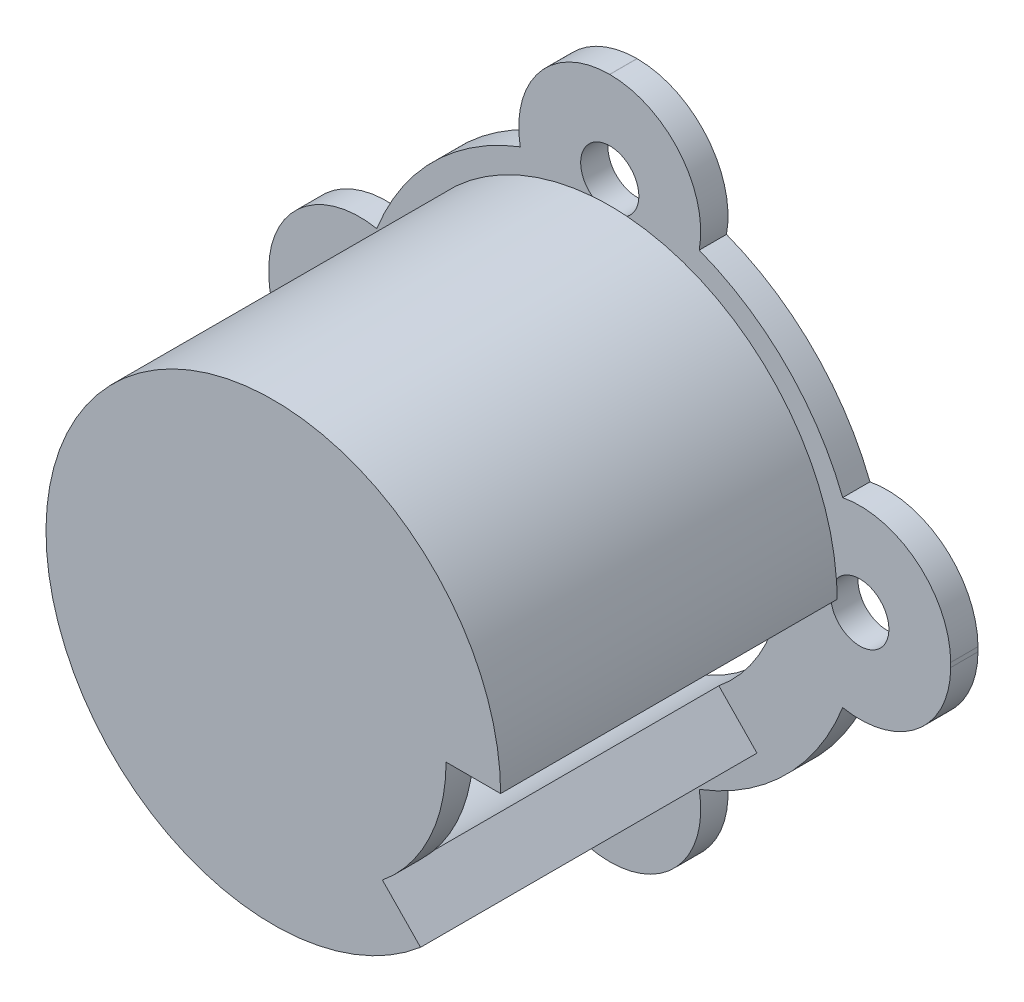
ISO-10303-21;
HEADER;
FILE_DESCRIPTION(('STEP AP214'),'2;1');
FILE_NAME('part.step','',(''),(''),'','','');
FILE_SCHEMA(('AUTOMOTIVE_DESIGN { 1 0 10303 214 1 1 1 1 }'));
ENDSEC;
DATA;
#1=APPLICATION_CONTEXT('core data for automotive mechanical design processes');
#2=APPLICATION_PROTOCOL_DEFINITION('international standard','automotive_design',2000,#1);
#3=PRODUCT_CONTEXT('',#1,'mechanical');
#4=PRODUCT('Part','Part','',(#3));
#5=PRODUCT_RELATED_PRODUCT_CATEGORY('part','',(#4));
#6=PRODUCT_DEFINITION_FORMATION('','',#4);
#7=PRODUCT_DEFINITION_CONTEXT('part definition',#1,'design');
#8=PRODUCT_DEFINITION('design','',#6,#7);
#9=PRODUCT_DEFINITION_SHAPE('','',#8);
#10=(LENGTH_UNIT() NAMED_UNIT(*) SI_UNIT(.MILLI.,.METRE.));
#11=(NAMED_UNIT(*) PLANE_ANGLE_UNIT() SI_UNIT($,.RADIAN.));
#12=(NAMED_UNIT(*) SI_UNIT($,.STERADIAN.) SOLID_ANGLE_UNIT());
#13=UNCERTAINTY_MEASURE_WITH_UNIT(LENGTH_MEASURE(1.E-05),#10,'distance_accuracy_value','');
#14=(GEOMETRIC_REPRESENTATION_CONTEXT(3) GLOBAL_UNCERTAINTY_ASSIGNED_CONTEXT((#13)) GLOBAL_UNIT_ASSIGNED_CONTEXT((#10,
#11,#12)) REPRESENTATION_CONTEXT('',''));
#15=CARTESIAN_POINT('',(0.,0.,0.));
#16=DIRECTION('',(0.,0.,1.));
#17=DIRECTION('',(1.,0.,0.));
#18=AXIS2_PLACEMENT_3D('',#15,#16,#17);
#19=CARTESIAN_POINT('',(0.,0.,-3.));
#20=DIRECTION('',(0.,0.,1.));
#21=DIRECTION('',(1.,0.,0.));
#22=AXIS2_PLACEMENT_3D('',#19,#20,#21);
#23=CYLINDRICAL_SURFACE('',#22,37.5);
#24=CARTESIAN_POINT('',(0.,0.,0.));
#25=DIRECTION('',(0.,0.,-1.));
#26=DIRECTION('',(-1.,0.,0.));
#27=AXIS2_PLACEMENT_3D('',#24,#25,#26);
#28=CIRCLE('',#27,37.5);
#29=CARTESIAN_POINT('',(37.4992082393606,0.243683034019491,0.));
#30=VERTEX_POINT('',#29);
#31=CARTESIAN_POINT('',(37.4992082393606,-0.243683034019488,0.));
#32=VERTEX_POINT('',#31);
#33=EDGE_CURVE('E335',#30,#32,#28,.T.);
#34=ORIENTED_EDGE('',*,*,#33,.T.);
#35=DIRECTION('',(0.,0.,1.));
#36=VECTOR('',#35,1.);
#37=CARTESIAN_POINT('',(37.4992082393606,-0.243683034019488,-3.));
#38=LINE('',#37,#36);
#39=CARTESIAN_POINT('',(37.4992082393606,-0.243683034019488,-3.));
#40=VERTEX_POINT('',#39);
#41=EDGE_CURVE('E11',#32,#40,#38,.F.);
#42=ORIENTED_EDGE('',*,*,#41,.T.);
#43=CARTESIAN_POINT('',(0.,0.,-3.));
#44=DIRECTION('',(0.,0.,-1.));
#45=DIRECTION('',(-1.,0.,0.));
#46=AXIS2_PLACEMENT_3D('',#43,#44,#45);
#47=CIRCLE('',#46,37.5);
#48=CARTESIAN_POINT('',(37.4992082393606,0.243683034019491,-3.));
#49=VERTEX_POINT('',#48);
#50=EDGE_CURVE('E328',#49,#40,#47,.T.);
#51=ORIENTED_EDGE('',*,*,#50,.F.);
#52=DIRECTION('',(0.,0.,1.));
#53=VECTOR('',#52,1.);
#54=CARTESIAN_POINT('',(37.4992082393606,0.243683034019491,-3.));
#55=LINE('',#54,#53);
#56=EDGE_CURVE('E441',#49,#30,#55,.T.);
#57=ORIENTED_EDGE('',*,*,#56,.T.);
#58=EDGE_LOOP('',(#34,#42,#51,#57));
#59=FACE_BOUND('',#58,.T.);
#60=ADVANCED_FACE('F41',(#59),#23,.T.);
#61=CARTESIAN_POINT('',(0.,0.,0.));
#62=DIRECTION('',(0.,0.,-1.));
#63=DIRECTION('',(-1.,0.,0.));
#64=AXIS2_PLACEMENT_3D('',#61,#62,#63);
#65=PLANE('',#64);
#66=CARTESIAN_POINT('',(0.,0.,0.));
#67=DIRECTION('',(0.,0.,1.));
#68=DIRECTION('',(1.,0.,0.));
#69=AXIS2_PLACEMENT_3D('',#66,#67,#68);
#70=CIRCLE('',#69,25.);
#71=CARTESIAN_POINT('',(-1.90315787161693,24.9274545454545,0.));
#72=VERTEX_POINT('',#71);
#73=CARTESIAN_POINT('',(-24.9274545454545,1.90315787161693,0.));
#74=VERTEX_POINT('',#73);
#75=EDGE_CURVE('E389',#72,#74,#70,.T.);
#76=ORIENTED_EDGE('',*,*,#75,.F.);
#77=CARTESIAN_POINT('',(0.,27.5,0.));
#78=DIRECTION('',(0.,0.,-1.));
#79=DIRECTION('',(-1.,0.,0.));
#80=AXIS2_PLACEMENT_3D('',#77,#78,#79);
#81=CIRCLE('',#80,3.2);
#82=CARTESIAN_POINT('',(1.90315787161693,24.9274545454545,0.));
#83=VERTEX_POINT('',#82);
#84=EDGE_CURVE('E401',#72,#83,#81,.T.);
#85=ORIENTED_EDGE('',*,*,#84,.T.);
#86=CARTESIAN_POINT('',(24.9274545454545,1.90315787161693,0.));
#87=VERTEX_POINT('',#86);
#88=EDGE_CURVE('E388',#87,#83,#70,.T.);
#89=ORIENTED_EDGE('',*,*,#88,.F.);
#90=CARTESIAN_POINT('',(27.5,0.,0.));
#91=DIRECTION('',(0.,0.,-1.));
#92=DIRECTION('',(-1.,0.,0.));
#93=AXIS2_PLACEMENT_3D('',#90,#91,#92);
#94=CIRCLE('',#93,3.2);
#95=CARTESIAN_POINT('',(24.3,0.,0.));
#96=VERTEX_POINT('',#95);
#97=EDGE_CURVE('E383',#87,#96,#94,.T.);
#98=ORIENTED_EDGE('',*,*,#97,.T.);
#99=DIRECTION('',(1.,0.,0.));
#100=VECTOR('',#99,1.);
#101=CARTESIAN_POINT('',(25.,0.,0.));
#102=LINE('',#101,#100);
#103=CARTESIAN_POINT('',(19.,0.,0.));
#104=VERTEX_POINT('',#103);
#105=EDGE_CURVE('E341',#104,#96,#102,.T.);
#106=ORIENTED_EDGE('',*,*,#105,.F.);
#107=CARTESIAN_POINT('',(0.,0.,0.));
#108=DIRECTION('',(0.,0.,-1.));
#109=DIRECTION('',(-1.,0.,0.));
#110=AXIS2_PLACEMENT_3D('',#107,#108,#109);
#111=CIRCLE('',#110,19.);
#112=CARTESIAN_POINT('',(11.9995781260314,-14.7312635166597,0.));
#113=VERTEX_POINT('',#112);
#114=EDGE_CURVE('E315',#104,#113,#111,.T.);
#115=ORIENTED_EDGE('',*,*,#114,.T.);
#116=DIRECTION('',(-0.696844075510194,0.717222653313699,0.));
#117=VECTOR('',#116,1.);
#118=CARTESIAN_POINT('',(16.1928103046797,-19.0471229963125,0.));
#119=LINE('',#118,#117);
#120=CARTESIAN_POINT('',(16.1928103046797,-19.0471229963125,0.));
#121=VERTEX_POINT('',#120);
#122=EDGE_CURVE('E327',#121,#113,#119,.T.);
#123=ORIENTED_EDGE('',*,*,#122,.F.);
#124=CARTESIAN_POINT('',(1.90315787161693,-24.9274545454545,0.));
#125=VERTEX_POINT('',#124);
#126=EDGE_CURVE('E378',#125,#121,#70,.T.);
#127=ORIENTED_EDGE('',*,*,#126,.F.);
#128=CARTESIAN_POINT('',(0.,-27.5,0.));
#129=DIRECTION('',(0.,0.,-1.));
#130=DIRECTION('',(-1.,0.,0.));
#131=AXIS2_PLACEMENT_3D('',#128,#129,#130);
#132=CIRCLE('',#131,3.2);
#133=CARTESIAN_POINT('',(-1.90315787161693,-24.9274545454545,0.));
#134=VERTEX_POINT('',#133);
#135=EDGE_CURVE('E393',#125,#134,#132,.T.);
#136=ORIENTED_EDGE('',*,*,#135,.T.);
#137=CARTESIAN_POINT('',(-24.9274545454545,-1.90315787161693,0.));
#138=VERTEX_POINT('',#137);
#139=EDGE_CURVE('E478',#138,#134,#70,.T.);
#140=ORIENTED_EDGE('',*,*,#139,.F.);
#141=CARTESIAN_POINT('',(-27.5,0.,0.));
#142=DIRECTION('',(0.,0.,-1.));
#143=DIRECTION('',(-1.,0.,0.));
#144=AXIS2_PLACEMENT_3D('',#141,#142,#143);
#145=CIRCLE('',#144,3.2);
#146=EDGE_CURVE('E397',#138,#74,#145,.T.);
#147=ORIENTED_EDGE('',*,*,#146,.T.);
#148=EDGE_LOOP('',(#76,#85,#89,#98,#106,#115,#123,#127,#136,#140,#147));
#149=FACE_BOUND('',#148,.T.);
#150=CARTESIAN_POINT('',(0.0101629240828799,-37.4999986228663,0.));
#151=VERTEX_POINT('',#150);
#152=CARTESIAN_POINT('',(-0.0101629240828752,-37.4999986228663,0.));
#153=VERTEX_POINT('',#152);
#154=EDGE_CURVE('E214',#151,#153,#28,.T.);
#155=ORIENTED_EDGE('',*,*,#154,.F.);
#156=CARTESIAN_POINT('',(0.00745281099411195,-27.499998990102,0.));
#157=DIRECTION('',(0.,0.,-1.));
#158=DIRECTION('',(-1.,0.,0.));
#159=AXIS2_PLACEMENT_3D('',#156,#157,#158);
#160=CIRCLE('',#159,10.);
#161=CARTESIAN_POINT('',(9.84028136240149,-25.6791522973165,0.));
#162=VERTEX_POINT('',#161);
#163=EDGE_CURVE('E50',#151,#162,#160,.F.);
#164=ORIENTED_EDGE('',*,*,#163,.T.);
#165=CARTESIAN_POINT('',(0.,0.,0.));
#166=DIRECTION('',(0.,0.,1.));
#167=DIRECTION('',(1.,0.,0.));
#168=AXIS2_PLACEMENT_3D('',#165,#166,#167);
#169=CIRCLE('',#168,27.5);
#170=CARTESIAN_POINT('',(25.617376914899,-10.,0.));
#171=VERTEX_POINT('',#170);
#172=EDGE_CURVE('E212',#162,#171,#169,.T.);
#173=ORIENTED_EDGE('',*,*,#172,.T.);
#174=CARTESIAN_POINT('',(27.4994193755311,-0.178700891614291,0.));
#175=DIRECTION('',(0.,0.,-1.));
#176=DIRECTION('',(-1.,0.,0.));
#177=AXIS2_PLACEMENT_3D('',#174,#175,#176);
#178=CIRCLE('',#177,10.);
#179=EDGE_CURVE('E57',#171,#32,#178,.F.);
#180=ORIENTED_EDGE('',*,*,#179,.T.);
#181=ORIENTED_EDGE('',*,*,#33,.F.);
#182=CARTESIAN_POINT('',(27.4994193755311,0.178700891614293,0.));
#183=DIRECTION('',(0.,0.,-1.));
#184=DIRECTION('',(-1.,0.,0.));
#185=AXIS2_PLACEMENT_3D('',#182,#183,#184);
#186=CIRCLE('',#185,10.);
#187=CARTESIAN_POINT('',(25.617376914899,10.,0.));
#188=VERTEX_POINT('',#187);
#189=EDGE_CURVE('E435',#30,#188,#186,.F.);
#190=ORIENTED_EDGE('',*,*,#189,.T.);
#191=CARTESIAN_POINT('',(0.,0.,0.));
#192=DIRECTION('',(0.,0.,-1.));
#193=DIRECTION('',(1.,0.,0.));
#194=AXIS2_PLACEMENT_3D('',#191,#192,#193);
#195=CIRCLE('',#194,27.5);
#196=CARTESIAN_POINT('',(9.84028136240149,25.6791522973165,0.));
#197=VERTEX_POINT('',#196);
#198=EDGE_CURVE('E254',#197,#188,#195,.T.);
#199=ORIENTED_EDGE('',*,*,#198,.F.);
#200=CARTESIAN_POINT('',(0.00745281099410848,27.499998990102,0.));
#201=DIRECTION('',(0.,0.,-1.));
#202=DIRECTION('',(-1.,0.,0.));
#203=AXIS2_PLACEMENT_3D('',#200,#201,#202);
#204=CIRCLE('',#203,10.);
#205=CARTESIAN_POINT('',(0.0101629240828752,37.4999986228663,0.));
#206=VERTEX_POINT('',#205);
#207=EDGE_CURVE('E438',#197,#206,#204,.F.);
#208=ORIENTED_EDGE('',*,*,#207,.T.);
#209=CARTESIAN_POINT('',(-0.0101629240828799,37.4999986228663,0.));
#210=VERTEX_POINT('',#209);
#211=EDGE_CURVE('E330',#210,#206,#28,.T.);
#212=ORIENTED_EDGE('',*,*,#211,.F.);
#213=CARTESIAN_POINT('',(-0.00745281099411195,27.499998990102,0.));
#214=DIRECTION('',(0.,0.,-1.));
#215=DIRECTION('',(-1.,0.,0.));
#216=AXIS2_PLACEMENT_3D('',#213,#214,#215);
#217=CIRCLE('',#216,10.);
#218=CARTESIAN_POINT('',(-9.84028136240149,25.6791522973165,0.));
#219=VERTEX_POINT('',#218);
#220=EDGE_CURVE('E422',#210,#219,#217,.F.);
#221=ORIENTED_EDGE('',*,*,#220,.T.);
#222=CARTESIAN_POINT('',(0.,0.,0.));
#223=DIRECTION('',(0.,0.,1.));
#224=DIRECTION('',(-1.,0.,0.));
#225=AXIS2_PLACEMENT_3D('',#222,#223,#224);
#226=CIRCLE('',#225,27.5);
#227=CARTESIAN_POINT('',(-25.617376914899,10.,0.));
#228=VERTEX_POINT('',#227);
#229=EDGE_CURVE('E270',#219,#228,#226,.T.);
#230=ORIENTED_EDGE('',*,*,#229,.T.);
#231=CARTESIAN_POINT('',(-27.4994193755311,0.178700891614291,0.));
#232=DIRECTION('',(0.,0.,-1.));
#233=DIRECTION('',(-1.,0.,0.));
#234=AXIS2_PLACEMENT_3D('',#231,#232,#233);
#235=CIRCLE('',#234,10.);
#236=CARTESIAN_POINT('',(-37.4992082393606,0.243683034019488,0.));
#237=VERTEX_POINT('',#236);
#238=EDGE_CURVE('E418',#228,#237,#235,.F.);
#239=ORIENTED_EDGE('',*,*,#238,.T.);
#240=CARTESIAN_POINT('',(-37.4992082393606,-0.243683034019491,0.));
#241=VERTEX_POINT('',#240);
#242=EDGE_CURVE('E320',#241,#237,#28,.T.);
#243=ORIENTED_EDGE('',*,*,#242,.F.);
#244=CARTESIAN_POINT('',(-27.4994193755311,-0.178700891614293,0.));
#245=DIRECTION('',(0.,0.,-1.));
#246=DIRECTION('',(-1.,0.,0.));
#247=AXIS2_PLACEMENT_3D('',#244,#245,#246);
#248=CIRCLE('',#247,10.);
#249=CARTESIAN_POINT('',(-25.617376914899,-10.,0.));
#250=VERTEX_POINT('',#249);
#251=EDGE_CURVE('E454',#241,#250,#248,.F.);
#252=ORIENTED_EDGE('',*,*,#251,.T.);
#253=CARTESIAN_POINT('',(0.,0.,0.));
#254=DIRECTION('',(0.,0.,-1.));
#255=DIRECTION('',(-1.,0.,0.));
#256=AXIS2_PLACEMENT_3D('',#253,#254,#255);
#257=CIRCLE('',#256,27.5);
#258=CARTESIAN_POINT('',(-9.84028136240149,-25.6791522973165,0.));
#259=VERTEX_POINT('',#258);
#260=EDGE_CURVE('E238',#259,#250,#257,.T.);
#261=ORIENTED_EDGE('',*,*,#260,.F.);
#262=CARTESIAN_POINT('',(-0.00745281099410848,-27.499998990102,0.));
#263=DIRECTION('',(0.,0.,-1.));
#264=DIRECTION('',(-1.,0.,0.));
#265=AXIS2_PLACEMENT_3D('',#262,#263,#264);
#266=CIRCLE('',#265,10.);
#267=EDGE_CURVE('E457',#259,#153,#266,.F.);
#268=ORIENTED_EDGE('',*,*,#267,.T.);
#269=EDGE_LOOP('',(#155,#164,#173,#180,#181,#190,#199,#208,#212,#221,#230,#239,#243,#252,#261,#268));
#270=FACE_BOUND('',#269,.T.);
#271=ADVANCED_FACE('F211',(#149,#270),#65,.F.);
#272=CARTESIAN_POINT('',(0.0101629240828799,-37.4999986228663,-3.));
#273=VERTEX_POINT('',#272);
#274=CARTESIAN_POINT('',(-0.0101629240828752,-37.4999986228663,-3.));
#275=VERTEX_POINT('',#274);
#276=EDGE_CURVE('E329',#273,#275,#47,.T.);
#277=ORIENTED_EDGE('',*,*,#276,.F.);
#278=DIRECTION('',(0.,0.,1.));
#279=VECTOR('',#278,1.);
#280=CARTESIAN_POINT('',(0.0101629240828799,-37.4999986228663,-3.));
#281=LINE('',#280,#279);
#282=EDGE_CURVE('E65',#273,#151,#281,.T.);
#283=ORIENTED_EDGE('',*,*,#282,.T.);
#284=ORIENTED_EDGE('',*,*,#154,.T.);
#285=DIRECTION('',(0.,0.,1.));
#286=VECTOR('',#285,1.);
#287=CARTESIAN_POINT('',(-0.0101629240828752,-37.4999986228663,-3.));
#288=LINE('',#287,#286);
#289=EDGE_CURVE('E444',#153,#275,#288,.F.);
#290=ORIENTED_EDGE('',*,*,#289,.T.);
#291=EDGE_LOOP('',(#277,#283,#284,#290));
#292=FACE_BOUND('',#291,.T.);
#293=ADVANCED_FACE('F547',(#292),#23,.T.);
#294=CARTESIAN_POINT('',(-37.4992082393606,-0.243683034019491,-3.));
#295=VERTEX_POINT('',#294);
#296=CARTESIAN_POINT('',(-37.4992082393606,0.243683034019488,-3.));
#297=VERTEX_POINT('',#296);
#298=EDGE_CURVE('E334',#295,#297,#47,.T.);
#299=ORIENTED_EDGE('',*,*,#298,.F.);
#300=DIRECTION('',(0.,0.,1.));
#301=VECTOR('',#300,1.);
#302=CARTESIAN_POINT('',(-37.4992082393606,-0.243683034019491,-3.));
#303=LINE('',#302,#301);
#304=EDGE_CURVE('E460',#295,#241,#303,.T.);
#305=ORIENTED_EDGE('',*,*,#304,.T.);
#306=ORIENTED_EDGE('',*,*,#242,.T.);
#307=DIRECTION('',(0.,0.,1.));
#308=VECTOR('',#307,1.);
#309=CARTESIAN_POINT('',(-37.4992082393606,0.243683034019488,-3.));
#310=LINE('',#309,#308);
#311=EDGE_CURVE('E411',#237,#297,#310,.F.);
#312=ORIENTED_EDGE('',*,*,#311,.T.);
#313=EDGE_LOOP('',(#299,#305,#306,#312));
#314=FACE_BOUND('',#313,.T.);
#315=ADVANCED_FACE('F504',(#314),#23,.T.);
#316=CARTESIAN_POINT('',(0.,0.,-3.));
#317=DIRECTION('',(0.,0.,-1.));
#318=DIRECTION('',(-1.,0.,0.));
#319=AXIS2_PLACEMENT_3D('',#316,#317,#318);
#320=PLANE('',#319);
#321=CARTESIAN_POINT('',(0.,0.,-3.));
#322=DIRECTION('',(0.,0.,1.));
#323=DIRECTION('',(1.,0.,0.));
#324=AXIS2_PLACEMENT_3D('',#321,#322,#323);
#325=CIRCLE('',#324,27.5);
#326=CARTESIAN_POINT('',(9.84028136240149,-25.6791522973165,-3.));
#327=VERTEX_POINT('',#326);
#328=CARTESIAN_POINT('',(25.617376914899,-10.,-3.));
#329=VERTEX_POINT('',#328);
#330=EDGE_CURVE('E227',#327,#329,#325,.T.);
#331=ORIENTED_EDGE('',*,*,#330,.F.);
#332=CARTESIAN_POINT('',(0.00745281099411195,-27.499998990102,-3.));
#333=DIRECTION('',(0.,0.,-1.));
#334=DIRECTION('',(-1.,0.,0.));
#335=AXIS2_PLACEMENT_3D('',#332,#333,#334);
#336=CIRCLE('',#335,10.);
#337=EDGE_CURVE('E230',#327,#273,#336,.T.);
#338=ORIENTED_EDGE('',*,*,#337,.T.);
#339=ORIENTED_EDGE('',*,*,#276,.T.);
#340=CARTESIAN_POINT('',(-0.00745281099410848,-27.499998990102,-3.));
#341=DIRECTION('',(0.,0.,-1.));
#342=DIRECTION('',(-1.,0.,0.));
#343=AXIS2_PLACEMENT_3D('',#340,#341,#342);
#344=CIRCLE('',#343,10.);
#345=CARTESIAN_POINT('',(-9.84028136240149,-25.6791522973165,-3.));
#346=VERTEX_POINT('',#345);
#347=EDGE_CURVE('E451',#275,#346,#344,.T.);
#348=ORIENTED_EDGE('',*,*,#347,.T.);
#349=CARTESIAN_POINT('',(0.,0.,-3.));
#350=DIRECTION('',(0.,0.,-1.));
#351=DIRECTION('',(-1.,0.,0.));
#352=AXIS2_PLACEMENT_3D('',#349,#350,#351);
#353=CIRCLE('',#352,27.5);
#354=CARTESIAN_POINT('',(-25.617376914899,-10.,-3.));
#355=VERTEX_POINT('',#354);
#356=EDGE_CURVE('E234',#346,#355,#353,.T.);
#357=ORIENTED_EDGE('',*,*,#356,.T.);
#358=CARTESIAN_POINT('',(-27.4994193755311,-0.178700891614293,-3.));
#359=DIRECTION('',(0.,0.,-1.));
#360=DIRECTION('',(-1.,0.,0.));
#361=AXIS2_PLACEMENT_3D('',#358,#359,#360);
#362=CIRCLE('',#361,10.);
#363=EDGE_CURVE('E448',#355,#295,#362,.T.);
#364=ORIENTED_EDGE('',*,*,#363,.T.);
#365=ORIENTED_EDGE('',*,*,#298,.T.);
#366=CARTESIAN_POINT('',(-27.4994193755311,0.178700891614291,-3.));
#367=DIRECTION('',(0.,0.,-1.));
#368=DIRECTION('',(-1.,0.,0.));
#369=AXIS2_PLACEMENT_3D('',#366,#367,#368);
#370=CIRCLE('',#369,10.);
#371=CARTESIAN_POINT('',(-25.617376914899,10.,-3.));
#372=VERTEX_POINT('',#371);
#373=EDGE_CURVE('E405',#297,#372,#370,.T.);
#374=ORIENTED_EDGE('',*,*,#373,.T.);
#375=CARTESIAN_POINT('',(0.,0.,-3.));
#376=DIRECTION('',(0.,0.,1.));
#377=DIRECTION('',(-1.,0.,0.));
#378=AXIS2_PLACEMENT_3D('',#375,#376,#377);
#379=CIRCLE('',#378,27.5);
#380=CARTESIAN_POINT('',(-9.84028136240149,25.6791522973165,-3.));
#381=VERTEX_POINT('',#380);
#382=EDGE_CURVE('E266',#381,#372,#379,.T.);
#383=ORIENTED_EDGE('',*,*,#382,.F.);
#384=CARTESIAN_POINT('',(-0.00745281099411195,27.499998990102,-3.));
#385=DIRECTION('',(0.,0.,-1.));
#386=DIRECTION('',(-1.,0.,0.));
#387=AXIS2_PLACEMENT_3D('',#384,#385,#386);
#388=CIRCLE('',#387,10.);
#389=CARTESIAN_POINT('',(-0.0101629240828799,37.4999986228663,-3.));
#390=VERTEX_POINT('',#389);
#391=EDGE_CURVE('E408',#381,#390,#388,.T.);
#392=ORIENTED_EDGE('',*,*,#391,.T.);
#393=CARTESIAN_POINT('',(0.0101629240828752,37.4999986228663,-3.));
#394=VERTEX_POINT('',#393);
#395=EDGE_CURVE('E323',#390,#394,#47,.T.);
#396=ORIENTED_EDGE('',*,*,#395,.T.);
#397=CARTESIAN_POINT('',(0.00745281099410848,27.499998990102,-3.));
#398=DIRECTION('',(0.,0.,-1.));
#399=DIRECTION('',(-1.,0.,0.));
#400=AXIS2_PLACEMENT_3D('',#397,#398,#399);
#401=CIRCLE('',#400,10.);
#402=CARTESIAN_POINT('',(9.84028136240149,25.6791522973165,-3.));
#403=VERTEX_POINT('',#402);
#404=EDGE_CURVE('E432',#394,#403,#401,.T.);
#405=ORIENTED_EDGE('',*,*,#404,.T.);
#406=CARTESIAN_POINT('',(0.,0.,-3.));
#407=DIRECTION('',(0.,0.,-1.));
#408=DIRECTION('',(1.,0.,0.));
#409=AXIS2_PLACEMENT_3D('',#406,#407,#408);
#410=CIRCLE('',#409,27.5);
#411=CARTESIAN_POINT('',(25.617376914899,10.,-3.));
#412=VERTEX_POINT('',#411);
#413=EDGE_CURVE('E250',#403,#412,#410,.T.);
#414=ORIENTED_EDGE('',*,*,#413,.T.);
#415=CARTESIAN_POINT('',(27.4994193755311,0.178700891614293,-3.));
#416=DIRECTION('',(0.,0.,-1.));
#417=DIRECTION('',(-1.,0.,0.));
#418=AXIS2_PLACEMENT_3D('',#415,#416,#417);
#419=CIRCLE('',#418,10.);
#420=EDGE_CURVE('E429',#412,#49,#419,.T.);
#421=ORIENTED_EDGE('',*,*,#420,.T.);
#422=ORIENTED_EDGE('',*,*,#50,.T.);
#423=CARTESIAN_POINT('',(27.4994193755311,-0.178700891614291,-3.));
#424=DIRECTION('',(0.,0.,-1.));
#425=DIRECTION('',(-1.,0.,0.));
#426=AXIS2_PLACEMENT_3D('',#423,#424,#425);
#427=CIRCLE('',#426,10.);
#428=EDGE_CURVE('E463',#40,#329,#427,.T.);
#429=ORIENTED_EDGE('',*,*,#428,.T.);
#430=EDGE_LOOP('',(#331,#338,#339,#348,#357,#364,#365,#374,#383,#392,#396,#405,#414,#421,#422,#429));
#431=FACE_BOUND('',#430,.T.);
#432=CARTESIAN_POINT('',(0.,27.5,-3.));
#433=DIRECTION('',(0.,0.,-1.));
#434=DIRECTION('',(-1.,0.,0.));
#435=AXIS2_PLACEMENT_3D('',#432,#433,#434);
#436=CIRCLE('',#435,3.2);
#437=CARTESIAN_POINT('',(-3.2,27.5,-3.));
#438=VERTEX_POINT('',#437);
#439=EDGE_CURVE('E282',#438,#438,#436,.T.);
#440=ORIENTED_EDGE('',*,*,#439,.F.);
#441=EDGE_LOOP('',(#440));
#442=FACE_BOUND('',#441,.T.);
#443=CARTESIAN_POINT('',(-27.5,0.,-3.));
#444=DIRECTION('',(0.,0.,-1.));
#445=DIRECTION('',(-1.,0.,0.));
#446=AXIS2_PLACEMENT_3D('',#443,#444,#445);
#447=CIRCLE('',#446,3.2);
#448=CARTESIAN_POINT('',(-30.7,0.,-3.));
#449=VERTEX_POINT('',#448);
#450=EDGE_CURVE('E292',#449,#449,#447,.T.);
#451=ORIENTED_EDGE('',*,*,#450,.F.);
#452=EDGE_LOOP('',(#451));
#453=FACE_BOUND('',#452,.T.);
#454=CARTESIAN_POINT('',(0.,-27.5,-3.));
#455=DIRECTION('',(0.,0.,-1.));
#456=DIRECTION('',(-1.,0.,0.));
#457=AXIS2_PLACEMENT_3D('',#454,#455,#456);
#458=CIRCLE('',#457,3.2);
#459=CARTESIAN_POINT('',(-3.2,-27.5,-3.));
#460=VERTEX_POINT('',#459);
#461=EDGE_CURVE('E300',#460,#460,#458,.T.);
#462=ORIENTED_EDGE('',*,*,#461,.F.);
#463=EDGE_LOOP('',(#462));
#464=FACE_BOUND('',#463,.T.);
#465=CARTESIAN_POINT('',(27.5,0.,-3.));
#466=DIRECTION('',(0.,0.,-1.));
#467=DIRECTION('',(-1.,0.,0.));
#468=AXIS2_PLACEMENT_3D('',#465,#466,#467);
#469=CIRCLE('',#468,3.2);
#470=CARTESIAN_POINT('',(24.3,0.,-3.));
#471=VERTEX_POINT('',#470);
#472=EDGE_CURVE('E308',#471,#471,#469,.T.);
#473=ORIENTED_EDGE('',*,*,#472,.F.);
#474=EDGE_LOOP('',(#473));
#475=FACE_BOUND('',#474,.T.);
#476=CARTESIAN_POINT('',(0.,0.,-3.));
#477=DIRECTION('',(0.,0.,-1.));
#478=DIRECTION('',(-1.,0.,0.));
#479=AXIS2_PLACEMENT_3D('',#476,#477,#478);
#480=CIRCLE('',#479,19.);
#481=CARTESIAN_POINT('',(-19.,0.,-3.));
#482=VERTEX_POINT('',#481);
#483=EDGE_CURVE('E316',#482,#482,#480,.T.);
#484=ORIENTED_EDGE('',*,*,#483,.F.);
#485=EDGE_LOOP('',(#484));
#486=FACE_BOUND('',#485,.T.);
#487=ADVANCED_FACE('F515',(#431,#442,#453,#464,#475,#486),#320,.T.);
#488=ORIENTED_EDGE('',*,*,#211,.T.);
#489=DIRECTION('',(0.,0.,1.));
#490=VECTOR('',#489,1.);
#491=CARTESIAN_POINT('',(0.0101629240828752,37.4999986228663,-3.));
#492=LINE('',#491,#490);
#493=EDGE_CURVE('E425',#206,#394,#492,.F.);
#494=ORIENTED_EDGE('',*,*,#493,.T.);
#495=ORIENTED_EDGE('',*,*,#395,.F.);
#496=DIRECTION('',(0.,0.,1.));
#497=VECTOR('',#496,1.);
#498=CARTESIAN_POINT('',(-0.0101629240828799,37.4999986228663,-3.));
#499=LINE('',#498,#497);
#500=EDGE_CURVE('E415',#390,#210,#499,.T.);
#501=ORIENTED_EDGE('',*,*,#500,.T.);
#502=EDGE_LOOP('',(#488,#494,#495,#501));
#503=FACE_BOUND('',#502,.T.);
#504=ADVANCED_FACE('F526',(#503),#23,.T.);
#505=CARTESIAN_POINT('',(0.,0.,37.));
#506=DIRECTION('',(0.,0.,-1.));
#507=DIRECTION('',(-1.,0.,0.));
#508=AXIS2_PLACEMENT_3D('',#505,#506,#507);
#509=CYLINDRICAL_SURFACE('',#508,25.);
#510=CARTESIAN_POINT('',(0.,0.,37.));
#511=DIRECTION('',(0.,0.,1.));
#512=DIRECTION('',(1.,0.,0.));
#513=AXIS2_PLACEMENT_3D('',#510,#511,#512);
#514=CIRCLE('',#513,25.);
#515=CARTESIAN_POINT('',(25.,0.,37.));
#516=VERTEX_POINT('',#515);
#517=CARTESIAN_POINT('',(16.1928103046797,-19.0471229963125,37.));
#518=VERTEX_POINT('',#517);
#519=EDGE_CURVE('E379',#516,#518,#514,.T.);
#520=ORIENTED_EDGE('',*,*,#519,.F.);
#521=DIRECTION('',(0.,0.,-1.));
#522=VECTOR('',#521,1.);
#523=CARTESIAN_POINT('',(25.,0.,37.));
#524=LINE('',#523,#522);
#525=CARTESIAN_POINT('',(25.,0.,0.));
#526=VERTEX_POINT('',#525);
#527=EDGE_CURVE('E357',#516,#526,#524,.T.);
#528=ORIENTED_EDGE('',*,*,#527,.T.);
#529=EDGE_CURVE('E384',#526,#87,#70,.T.);
#530=ORIENTED_EDGE('',*,*,#529,.T.);
#531=ORIENTED_EDGE('',*,*,#88,.T.);
#532=EDGE_CURVE('E474',#83,#72,#70,.T.);
#533=ORIENTED_EDGE('',*,*,#532,.T.);
#534=ORIENTED_EDGE('',*,*,#75,.T.);
#535=EDGE_CURVE('E480',#74,#138,#70,.T.);
#536=ORIENTED_EDGE('',*,*,#535,.T.);
#537=ORIENTED_EDGE('',*,*,#139,.T.);
#538=EDGE_CURVE('E475',#134,#125,#70,.T.);
#539=ORIENTED_EDGE('',*,*,#538,.T.);
#540=ORIENTED_EDGE('',*,*,#126,.T.);
#541=DIRECTION('',(0.,0.,-1.));
#542=VECTOR('',#541,1.);
#543=CARTESIAN_POINT('',(16.1928103046797,-19.0471229963125,37.));
#544=LINE('',#543,#542);
#545=EDGE_CURVE('E349',#518,#121,#544,.T.);
#546=ORIENTED_EDGE('',*,*,#545,.F.);
#547=EDGE_LOOP('',(#520,#528,#530,#531,#533,#534,#536,#537,#539,#540,#546));
#548=FACE_BOUND('',#547,.T.);
#549=ADVANCED_FACE('F577',(#548),#509,.T.);
#550=CARTESIAN_POINT('',(0.,0.,37.));
#551=DIRECTION('',(0.,0.,1.));
#552=DIRECTION('',(1.,0.,0.));
#553=AXIS2_PLACEMENT_3D('',#550,#551,#552);
#554=PLANE('',#553);
#555=DIRECTION('',(1.,0.,0.));
#556=VECTOR('',#555,1.);
#557=CARTESIAN_POINT('',(25.,0.,37.));
#558=LINE('',#557,#556);
#559=CARTESIAN_POINT('',(19.,0.,37.));
#560=VERTEX_POINT('',#559);
#561=EDGE_CURVE('E345',#560,#516,#558,.T.);
#562=ORIENTED_EDGE('',*,*,#561,.T.);
#563=ORIENTED_EDGE('',*,*,#519,.T.);
#564=DIRECTION('',(-0.696844075510194,0.717222653313699,0.));
#565=VECTOR('',#564,1.);
#566=CARTESIAN_POINT('',(16.1928103046797,-19.0471229963125,37.));
#567=LINE('',#566,#565);
#568=CARTESIAN_POINT('',(11.9995781260314,-14.7312635166597,37.));
#569=VERTEX_POINT('',#568);
#570=EDGE_CURVE('E336',#518,#569,#567,.T.);
#571=ORIENTED_EDGE('',*,*,#570,.T.);
#572=CARTESIAN_POINT('',(0.,0.,37.));
#573=DIRECTION('',(0.,0.,1.));
#574=DIRECTION('',(1.,0.,0.));
#575=AXIS2_PLACEMENT_3D('',#572,#573,#574);
#576=CIRCLE('',#575,19.);
#577=EDGE_CURVE('E340',#569,#560,#576,.T.);
#578=ORIENTED_EDGE('',*,*,#577,.T.);
#579=EDGE_LOOP('',(#562,#563,#571,#578));
#580=FACE_BOUND('',#579,.T.);
#581=ADVANCED_FACE('F582',(#580),#554,.T.);
#582=CARTESIAN_POINT('',(0.,0.,-3.));
#583=DIRECTION('',(0.,0.,1.));
#584=DIRECTION('',(1.,0.,0.));
#585=AXIS2_PLACEMENT_3D('',#582,#583,#584);
#586=CYLINDRICAL_SURFACE('',#585,19.);
#587=DIRECTION('',(0.,0.,-1.));
#588=VECTOR('',#587,1.);
#589=CARTESIAN_POINT('',(19.,0.,37.));
#590=LINE('',#589,#588);
#591=CARTESIAN_POINT('',(19.,0.,34.));
#592=VERTEX_POINT('',#591);
#593=EDGE_CURVE('E366',#592,#104,#590,.T.);
#594=ORIENTED_EDGE('',*,*,#593,.F.);
#595=CARTESIAN_POINT('',(0.,0.,34.));
#596=DIRECTION('',(0.,0.,-1.));
#597=DIRECTION('',(-1.,0.,0.));
#598=AXIS2_PLACEMENT_3D('',#595,#596,#597);
#599=CIRCLE('',#598,19.);
#600=CARTESIAN_POINT('',(11.9995781260314,-14.7312635166597,34.));
#601=VERTEX_POINT('',#600);
#602=EDGE_CURVE('E361',#601,#592,#599,.T.);
#603=ORIENTED_EDGE('',*,*,#602,.F.);
#604=DIRECTION('',(0.,0.,-1.));
#605=VECTOR('',#604,1.);
#606=CARTESIAN_POINT('',(11.9995781260314,-14.7312635166597,37.));
#607=LINE('',#606,#605);
#608=EDGE_CURVE('E370',#601,#113,#607,.T.);
#609=ORIENTED_EDGE('',*,*,#608,.T.);
#610=ORIENTED_EDGE('',*,*,#114,.F.);
#611=EDGE_LOOP('',(#594,#603,#609,#610));
#612=FACE_BOUND('',#611,.T.);
#613=ORIENTED_EDGE('',*,*,#483,.T.);
#614=EDGE_LOOP('',(#613));
#615=FACE_BOUND('',#614,.T.);
#616=ADVANCED_FACE('F820',(#612,#615),#586,.F.);
#617=CARTESIAN_POINT('',(0.,0.,34.));
#618=DIRECTION('',(0.,0.,-1.));
#619=DIRECTION('',(-1.,0.,0.));
#620=AXIS2_PLACEMENT_3D('',#617,#618,#619);
#621=PLANE('',#620);
#622=EDGE_CURVE('E374',#592,#601,#599,.T.);
#623=ORIENTED_EDGE('',*,*,#622,.T.);
#624=ORIENTED_EDGE('',*,*,#602,.T.);
#625=EDGE_LOOP('',(#623,#624));
#626=FACE_BOUND('',#625,.T.);
#627=ADVANCED_FACE('F795',(#626),#621,.T.);
#628=CARTESIAN_POINT('',(25.,0.,37.));
#629=DIRECTION('',(0.,1.,0.));
#630=DIRECTION('',(0.,0.,1.));
#631=AXIS2_PLACEMENT_3D('',#628,#629,#630);
#632=PLANE('',#631);
#633=ORIENTED_EDGE('',*,*,#105,.T.);
#634=EDGE_CURVE('E353',#96,#526,#102,.T.);
#635=ORIENTED_EDGE('',*,*,#634,.T.);
#636=ORIENTED_EDGE('',*,*,#527,.F.);
#637=ORIENTED_EDGE('',*,*,#561,.F.);
#638=EDGE_CURVE('E362',#560,#592,#590,.T.);
#639=ORIENTED_EDGE('',*,*,#638,.T.);
#640=ORIENTED_EDGE('',*,*,#593,.T.);
#641=EDGE_LOOP('',(#633,#635,#636,#637,#639,#640));
#642=FACE_BOUND('',#641,.T.);
#643=ADVANCED_FACE('F789',(#642),#632,.F.);
#644=CARTESIAN_POINT('',(0.,0.,37.));
#645=DIRECTION('',(0.,0.,-1.));
#646=DIRECTION('',(-1.,0.,0.));
#647=AXIS2_PLACEMENT_3D('',#644,#645,#646);
#648=CYLINDRICAL_SURFACE('',#647,19.);
#649=ORIENTED_EDGE('',*,*,#622,.F.);
#650=ORIENTED_EDGE('',*,*,#638,.F.);
#651=ORIENTED_EDGE('',*,*,#577,.F.);
#652=EDGE_CURVE('E367',#569,#601,#607,.T.);
#653=ORIENTED_EDGE('',*,*,#652,.T.);
#654=EDGE_LOOP('',(#649,#650,#651,#653));
#655=FACE_BOUND('',#654,.T.);
#656=ADVANCED_FACE('F794',(#655),#648,.T.);
#657=CARTESIAN_POINT('',(16.1928103046797,-19.0471229963125,37.));
#658=DIRECTION('',(-0.717222653313699,-0.696844075510194,0.));
#659=DIRECTION('',(0.696844075510194,-0.717222653313699,0.));
#660=AXIS2_PLACEMENT_3D('',#657,#658,#659);
#661=PLANE('',#660);
#662=ORIENTED_EDGE('',*,*,#122,.T.);
#663=ORIENTED_EDGE('',*,*,#608,.F.);
#664=ORIENTED_EDGE('',*,*,#652,.F.);
#665=ORIENTED_EDGE('',*,*,#570,.F.);
#666=ORIENTED_EDGE('',*,*,#545,.T.);
#667=EDGE_LOOP('',(#662,#663,#664,#665,#666));
#668=FACE_BOUND('',#667,.T.);
#669=ADVANCED_FACE('F781',(#668),#661,.F.);
#670=CARTESIAN_POINT('',(27.5,0.,-3.));
#671=DIRECTION('',(0.,0.,-1.));
#672=DIRECTION('',(-1.,0.,0.));
#673=AXIS2_PLACEMENT_3D('',#670,#671,#672);
#674=CYLINDRICAL_SURFACE('',#673,3.2);
#675=CARTESIAN_POINT('',(27.5,0.,0.));
#676=DIRECTION('',(0.,0.,-1.));
#677=DIRECTION('',(-1.,0.,0.));
#678=AXIS2_PLACEMENT_3D('',#675,#676,#677);
#679=CIRCLE('',#678,3.2);
#680=EDGE_CURVE('E312',#87,#96,#679,.F.);
#681=ORIENTED_EDGE('',*,*,#680,.T.);
#682=ORIENTED_EDGE('',*,*,#97,.F.);
#683=EDGE_LOOP('',(#681,#682));
#684=FACE_BOUND('',#683,.T.);
#685=ORIENTED_EDGE('',*,*,#472,.T.);
#686=EDGE_LOOP('',(#685));
#687=FACE_BOUND('',#686,.T.);
#688=ADVANCED_FACE('F771',(#684,#687),#674,.F.);
#689=CARTESIAN_POINT('',(0.,0.,0.));
#690=DIRECTION('',(0.,0.,-1.));
#691=DIRECTION('',(-1.,0.,0.));
#692=AXIS2_PLACEMENT_3D('',#689,#690,#691);
#693=PLANE('',#692);
#694=ORIENTED_EDGE('',*,*,#634,.F.);
#695=ORIENTED_EDGE('',*,*,#680,.F.);
#696=ORIENTED_EDGE('',*,*,#529,.F.);
#697=EDGE_LOOP('',(#694,#695,#696));
#698=FACE_BOUND('',#697,.T.);
#699=ADVANCED_FACE('F761',(#698),#693,.T.);
#700=CARTESIAN_POINT('',(0.,-27.5,-3.));
#701=DIRECTION('',(0.,0.,-1.));
#702=DIRECTION('',(-1.,0.,0.));
#703=AXIS2_PLACEMENT_3D('',#700,#701,#702);
#704=CYLINDRICAL_SURFACE('',#703,3.2);
#705=CARTESIAN_POINT('',(0.,-27.5,0.));
#706=DIRECTION('',(0.,0.,-1.));
#707=DIRECTION('',(-1.,0.,0.));
#708=AXIS2_PLACEMENT_3D('',#705,#706,#707);
#709=CIRCLE('',#708,3.2);
#710=EDGE_CURVE('E304',#125,#134,#709,.F.);
#711=ORIENTED_EDGE('',*,*,#710,.T.);
#712=ORIENTED_EDGE('',*,*,#135,.F.);
#713=EDGE_LOOP('',(#711,#712));
#714=FACE_BOUND('',#713,.T.);
#715=ORIENTED_EDGE('',*,*,#461,.T.);
#716=EDGE_LOOP('',(#715));
#717=FACE_BOUND('',#716,.T.);
#718=ADVANCED_FACE('F751',(#714,#717),#704,.F.);
#719=CARTESIAN_POINT('',(0.,0.,0.));
#720=DIRECTION('',(0.,0.,-1.));
#721=DIRECTION('',(-1.,0.,0.));
#722=AXIS2_PLACEMENT_3D('',#719,#720,#721);
#723=PLANE('',#722);
#724=ORIENTED_EDGE('',*,*,#710,.F.);
#725=ORIENTED_EDGE('',*,*,#538,.F.);
#726=EDGE_LOOP('',(#724,#725));
#727=FACE_BOUND('',#726,.T.);
#728=ADVANCED_FACE('F741',(#727),#723,.T.);
#729=CARTESIAN_POINT('',(-27.5,0.,-3.));
#730=DIRECTION('',(0.,0.,-1.));
#731=DIRECTION('',(-1.,0.,0.));
#732=AXIS2_PLACEMENT_3D('',#729,#730,#731);
#733=CYLINDRICAL_SURFACE('',#732,3.2);
#734=CARTESIAN_POINT('',(-27.5,0.,0.));
#735=DIRECTION('',(0.,0.,-1.));
#736=DIRECTION('',(-1.,0.,0.));
#737=AXIS2_PLACEMENT_3D('',#734,#735,#736);
#738=CIRCLE('',#737,3.2);
#739=EDGE_CURVE('E296',#138,#74,#738,.F.);
#740=ORIENTED_EDGE('',*,*,#739,.T.);
#741=ORIENTED_EDGE('',*,*,#146,.F.);
#742=EDGE_LOOP('',(#740,#741));
#743=FACE_BOUND('',#742,.T.);
#744=ORIENTED_EDGE('',*,*,#450,.T.);
#745=EDGE_LOOP('',(#744));
#746=FACE_BOUND('',#745,.T.);
#747=ADVANCED_FACE('F731',(#743,#746),#733,.F.);
#748=CARTESIAN_POINT('',(0.,0.,0.));
#749=DIRECTION('',(0.,0.,-1.));
#750=DIRECTION('',(-1.,0.,0.));
#751=AXIS2_PLACEMENT_3D('',#748,#749,#750);
#752=PLANE('',#751);
#753=ORIENTED_EDGE('',*,*,#739,.F.);
#754=ORIENTED_EDGE('',*,*,#535,.F.);
#755=EDGE_LOOP('',(#753,#754));
#756=FACE_BOUND('',#755,.T.);
#757=ADVANCED_FACE('F721',(#756),#752,.T.);
#758=CARTESIAN_POINT('',(0.,27.5,-3.));
#759=DIRECTION('',(0.,0.,-1.));
#760=DIRECTION('',(-1.,0.,0.));
#761=AXIS2_PLACEMENT_3D('',#758,#759,#760);
#762=CYLINDRICAL_SURFACE('',#761,3.2);
#763=CARTESIAN_POINT('',(0.,27.5,0.));
#764=DIRECTION('',(0.,0.,-1.));
#765=DIRECTION('',(-1.,0.,0.));
#766=AXIS2_PLACEMENT_3D('',#763,#764,#765);
#767=CIRCLE('',#766,3.2);
#768=EDGE_CURVE('E289',#72,#83,#767,.F.);
#769=ORIENTED_EDGE('',*,*,#768,.T.);
#770=ORIENTED_EDGE('',*,*,#84,.F.);
#771=EDGE_LOOP('',(#769,#770));
#772=FACE_BOUND('',#771,.T.);
#773=ORIENTED_EDGE('',*,*,#439,.T.);
#774=EDGE_LOOP('',(#773));
#775=FACE_BOUND('',#774,.T.);
#776=ADVANCED_FACE('F711',(#772,#775),#762,.F.);
#777=CARTESIAN_POINT('',(0.,0.,0.));
#778=DIRECTION('',(0.,0.,-1.));
#779=DIRECTION('',(-1.,0.,0.));
#780=AXIS2_PLACEMENT_3D('',#777,#778,#779);
#781=PLANE('',#780);
#782=ORIENTED_EDGE('',*,*,#768,.F.);
#783=ORIENTED_EDGE('',*,*,#532,.F.);
#784=EDGE_LOOP('',(#782,#783));
#785=FACE_BOUND('',#784,.T.);
#786=ADVANCED_FACE('F702',(#785),#781,.T.);
#787=CARTESIAN_POINT('',(0.,0.,0.));
#788=DIRECTION('',(0.,0.,-1.));
#789=DIRECTION('',(-1.,0.,0.));
#790=AXIS2_PLACEMENT_3D('',#787,#788,#789);
#791=CYLINDRICAL_SURFACE('',#790,27.5);
#792=ORIENTED_EDGE('',*,*,#382,.T.);
#793=DIRECTION('',(0.,0.,-1.));
#794=VECTOR('',#793,1.);
#795=CARTESIAN_POINT('',(-25.617376914899,10.,0.));
#796=LINE('',#795,#794);
#797=EDGE_CURVE('E278',#228,#372,#796,.T.);
#798=ORIENTED_EDGE('',*,*,#797,.F.);
#799=ORIENTED_EDGE('',*,*,#229,.F.);
#800=DIRECTION('',(0.,0.,-1.));
#801=VECTOR('',#800,1.);
#802=CARTESIAN_POINT('',(-9.84028136240149,25.6791522973165,0.));
#803=LINE('',#802,#801);
#804=EDGE_CURVE('E274',#219,#381,#803,.T.);
#805=ORIENTED_EDGE('',*,*,#804,.T.);
#806=EDGE_LOOP('',(#792,#798,#799,#805));
#807=FACE_BOUND('',#806,.T.);
#808=ADVANCED_FACE('F518',(#807),#791,.T.);
#809=CARTESIAN_POINT('',(-0.00745281099411195,27.499998990102,-3.));
#810=DIRECTION('',(0.,0.,1.));
#811=DIRECTION('',(1.,0.,0.));
#812=AXIS2_PLACEMENT_3D('',#809,#810,#811);
#813=CYLINDRICAL_SURFACE('',#812,10.);
#814=ORIENTED_EDGE('',*,*,#220,.F.);
#815=ORIENTED_EDGE('',*,*,#500,.F.);
#816=ORIENTED_EDGE('',*,*,#391,.F.);
#817=ORIENTED_EDGE('',*,*,#804,.F.);
#818=EDGE_LOOP('',(#814,#815,#816,#817));
#819=FACE_BOUND('',#818,.T.);
#820=ADVANCED_FACE('F522',(#819),#813,.T.);
#821=CARTESIAN_POINT('',(-27.4994193755311,0.178700891614291,0.));
#822=DIRECTION('',(0.,0.,1.));
#823=DIRECTION('',(1.,0.,0.));
#824=AXIS2_PLACEMENT_3D('',#821,#822,#823);
#825=CYLINDRICAL_SURFACE('',#824,10.);
#826=ORIENTED_EDGE('',*,*,#238,.F.);
#827=ORIENTED_EDGE('',*,*,#797,.T.);
#828=ORIENTED_EDGE('',*,*,#373,.F.);
#829=ORIENTED_EDGE('',*,*,#311,.F.);
#830=EDGE_LOOP('',(#826,#827,#828,#829));
#831=FACE_BOUND('',#830,.T.);
#832=ADVANCED_FACE('F512',(#831),#825,.T.);
#833=CARTESIAN_POINT('',(0.,0.,0.));
#834=DIRECTION('',(0.,0.,-1.));
#835=DIRECTION('',(-1.,0.,0.));
#836=AXIS2_PLACEMENT_3D('',#833,#834,#835);
#837=CYLINDRICAL_SURFACE('',#836,27.5);
#838=ORIENTED_EDGE('',*,*,#413,.F.);
#839=DIRECTION('',(0.,0.,-1.));
#840=VECTOR('',#839,1.);
#841=CARTESIAN_POINT('',(9.84028136240149,25.6791522973165,0.));
#842=LINE('',#841,#840);
#843=EDGE_CURVE('E262',#197,#403,#842,.T.);
#844=ORIENTED_EDGE('',*,*,#843,.F.);
#845=ORIENTED_EDGE('',*,*,#198,.T.);
#846=DIRECTION('',(0.,0.,-1.));
#847=VECTOR('',#846,1.);
#848=CARTESIAN_POINT('',(25.617376914899,10.,0.));
#849=LINE('',#848,#847);
#850=EDGE_CURVE('E258',#188,#412,#849,.T.);
#851=ORIENTED_EDGE('',*,*,#850,.T.);
#852=EDGE_LOOP('',(#838,#844,#845,#851));
#853=FACE_BOUND('',#852,.T.);
#854=ADVANCED_FACE('F534',(#853),#837,.T.);
#855=CARTESIAN_POINT('',(0.00745281099410848,27.499998990102,0.));
#856=DIRECTION('',(0.,0.,1.));
#857=DIRECTION('',(1.,0.,0.));
#858=AXIS2_PLACEMENT_3D('',#855,#856,#857);
#859=CYLINDRICAL_SURFACE('',#858,10.);
#860=ORIENTED_EDGE('',*,*,#207,.F.);
#861=ORIENTED_EDGE('',*,*,#843,.T.);
#862=ORIENTED_EDGE('',*,*,#404,.F.);
#863=ORIENTED_EDGE('',*,*,#493,.F.);
#864=EDGE_LOOP('',(#860,#861,#862,#863));
#865=FACE_BOUND('',#864,.T.);
#866=ADVANCED_FACE('F531',(#865),#859,.T.);
#867=CARTESIAN_POINT('',(27.4994193755311,0.178700891614293,-3.));
#868=DIRECTION('',(0.,0.,1.));
#869=DIRECTION('',(1.,0.,0.));
#870=AXIS2_PLACEMENT_3D('',#867,#868,#869);
#871=CYLINDRICAL_SURFACE('',#870,10.);
#872=ORIENTED_EDGE('',*,*,#189,.F.);
#873=ORIENTED_EDGE('',*,*,#56,.F.);
#874=ORIENTED_EDGE('',*,*,#420,.F.);
#875=ORIENTED_EDGE('',*,*,#850,.F.);
#876=EDGE_LOOP('',(#872,#873,#874,#875));
#877=FACE_BOUND('',#876,.T.);
#878=ADVANCED_FACE('F539',(#877),#871,.T.);
#879=CARTESIAN_POINT('',(0.,0.,0.));
#880=DIRECTION('',(0.,0.,-1.));
#881=DIRECTION('',(-1.,0.,0.));
#882=AXIS2_PLACEMENT_3D('',#879,#880,#881);
#883=CYLINDRICAL_SURFACE('',#882,27.5);
#884=ORIENTED_EDGE('',*,*,#356,.F.);
#885=DIRECTION('',(0.,0.,-1.));
#886=VECTOR('',#885,1.);
#887=CARTESIAN_POINT('',(-9.84028136240149,-25.6791522973165,0.));
#888=LINE('',#887,#886);
#889=EDGE_CURVE('E246',#259,#346,#888,.T.);
#890=ORIENTED_EDGE('',*,*,#889,.F.);
#891=ORIENTED_EDGE('',*,*,#260,.T.);
#892=DIRECTION('',(0.,0.,-1.));
#893=VECTOR('',#892,1.);
#894=CARTESIAN_POINT('',(-25.617376914899,-10.,0.));
#895=LINE('',#894,#893);
#896=EDGE_CURVE('E242',#250,#355,#895,.T.);
#897=ORIENTED_EDGE('',*,*,#896,.T.);
#898=EDGE_LOOP('',(#884,#890,#891,#897));
#899=FACE_BOUND('',#898,.T.);
#900=ADVANCED_FACE('F554',(#899),#883,.T.);
#901=CARTESIAN_POINT('',(-0.00745281099410848,-27.499998990102,0.));
#902=DIRECTION('',(0.,0.,1.));
#903=DIRECTION('',(1.,0.,0.));
#904=AXIS2_PLACEMENT_3D('',#901,#902,#903);
#905=CYLINDRICAL_SURFACE('',#904,10.);
#906=ORIENTED_EDGE('',*,*,#267,.F.);
#907=ORIENTED_EDGE('',*,*,#889,.T.);
#908=ORIENTED_EDGE('',*,*,#347,.F.);
#909=ORIENTED_EDGE('',*,*,#289,.F.);
#910=EDGE_LOOP('',(#906,#907,#908,#909));
#911=FACE_BOUND('',#910,.T.);
#912=ADVANCED_FACE('F551',(#911),#905,.T.);
#913=CARTESIAN_POINT('',(-27.4994193755311,-0.178700891614293,-3.));
#914=DIRECTION('',(0.,0.,1.));
#915=DIRECTION('',(1.,0.,0.));
#916=AXIS2_PLACEMENT_3D('',#913,#914,#915);
#917=CYLINDRICAL_SURFACE('',#916,10.);
#918=ORIENTED_EDGE('',*,*,#251,.F.);
#919=ORIENTED_EDGE('',*,*,#304,.F.);
#920=ORIENTED_EDGE('',*,*,#363,.F.);
#921=ORIENTED_EDGE('',*,*,#896,.F.);
#922=EDGE_LOOP('',(#918,#919,#920,#921));
#923=FACE_BOUND('',#922,.T.);
#924=ADVANCED_FACE('F558',(#923),#917,.T.);
#925=CARTESIAN_POINT('',(0.,0.,0.));
#926=DIRECTION('',(0.,0.,-1.));
#927=DIRECTION('',(-1.,0.,0.));
#928=AXIS2_PLACEMENT_3D('',#925,#926,#927);
#929=CYLINDRICAL_SURFACE('',#928,27.5);
#930=ORIENTED_EDGE('',*,*,#330,.T.);
#931=DIRECTION('',(0.,0.,-1.));
#932=VECTOR('',#931,1.);
#933=CARTESIAN_POINT('',(25.617376914899,-10.,0.));
#934=LINE('',#933,#932);
#935=EDGE_CURVE('E225',#171,#329,#934,.T.);
#936=ORIENTED_EDGE('',*,*,#935,.F.);
#937=ORIENTED_EDGE('',*,*,#172,.F.);
#938=DIRECTION('',(0.,0.,-1.));
#939=VECTOR('',#938,1.);
#940=CARTESIAN_POINT('',(9.84028136240149,-25.6791522973165,0.));
#941=LINE('',#940,#939);
#942=EDGE_CURVE('E222',#162,#327,#941,.T.);
#943=ORIENTED_EDGE('',*,*,#942,.T.);
#944=EDGE_LOOP('',(#930,#936,#937,#943));
#945=FACE_BOUND('',#944,.T.);
#946=ADVANCED_FACE('F221',(#945),#929,.T.);
#947=CARTESIAN_POINT('',(0.00745281099411195,-27.499998990102,-3.));
#948=DIRECTION('',(0.,0.,1.));
#949=DIRECTION('',(1.,0.,0.));
#950=AXIS2_PLACEMENT_3D('',#947,#948,#949);
#951=CYLINDRICAL_SURFACE('',#950,10.);
#952=ORIENTED_EDGE('',*,*,#163,.F.);
#953=ORIENTED_EDGE('',*,*,#282,.F.);
#954=ORIENTED_EDGE('',*,*,#337,.F.);
#955=ORIENTED_EDGE('',*,*,#942,.F.);
#956=EDGE_LOOP('',(#952,#953,#954,#955));
#957=FACE_BOUND('',#956,.T.);
#958=ADVANCED_FACE('F229',(#957),#951,.T.);
#959=CARTESIAN_POINT('',(27.4994193755311,-0.178700891614291,0.));
#960=DIRECTION('',(0.,0.,1.));
#961=DIRECTION('',(1.,0.,0.));
#962=AXIS2_PLACEMENT_3D('',#959,#960,#961);
#963=CYLINDRICAL_SURFACE('',#962,10.);
#964=ORIENTED_EDGE('',*,*,#179,.F.);
#965=ORIENTED_EDGE('',*,*,#935,.T.);
#966=ORIENTED_EDGE('',*,*,#428,.F.);
#967=ORIENTED_EDGE('',*,*,#41,.F.);
#968=EDGE_LOOP('',(#964,#965,#966,#967));
#969=FACE_BOUND('',#968,.T.);
#970=ADVANCED_FACE('F43',(#969),#963,.T.);
#971=CLOSED_SHELL('',(#60,#271,#293,#315,#487,#504,#549,#581,#616,#627,#643,#656,#669,#688,#699,
#718,#728,#747,#757,#776,#786,#808,#820,#832,#854,#866,#878,#900,#912,#924,#946,#958,#970));
#972=MANIFOLD_SOLID_BREP('B2',#971);
#973=ADVANCED_BREP_SHAPE_REPRESENTATION('',(#18,#972),#14);
#974=SHAPE_DEFINITION_REPRESENTATION(#9,#973);
ENDSEC;
END-ISO-10303-21;
